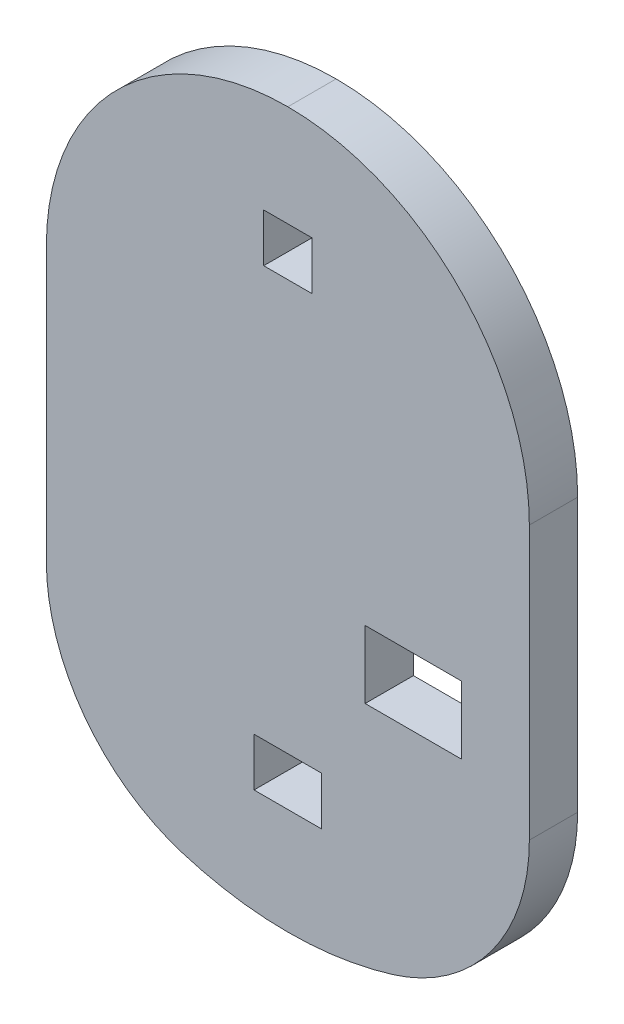
ISO-10303-21;
HEADER;
FILE_DESCRIPTION(('STEP AP214'),'2;1');
FILE_NAME('part.step','',(''),(''),'','','');
FILE_SCHEMA(('AUTOMOTIVE_DESIGN { 1 0 10303 214 1 1 1 1 }'));
ENDSEC;
DATA;
#1=APPLICATION_CONTEXT('core data for automotive mechanical design processes');
#2=APPLICATION_PROTOCOL_DEFINITION('international standard','automotive_design',2000,#1);
#3=PRODUCT_CONTEXT('',#1,'mechanical');
#4=PRODUCT('Part','Part','',(#3));
#5=PRODUCT_RELATED_PRODUCT_CATEGORY('part','',(#4));
#6=PRODUCT_DEFINITION_FORMATION('','',#4);
#7=PRODUCT_DEFINITION_CONTEXT('part definition',#1,'design');
#8=PRODUCT_DEFINITION('design','',#6,#7);
#9=PRODUCT_DEFINITION_SHAPE('','',#8);
#10=(LENGTH_UNIT() NAMED_UNIT(*) SI_UNIT(.MILLI.,.METRE.));
#11=(NAMED_UNIT(*) PLANE_ANGLE_UNIT() SI_UNIT($,.RADIAN.));
#12=(NAMED_UNIT(*) SI_UNIT($,.STERADIAN.) SOLID_ANGLE_UNIT());
#13=UNCERTAINTY_MEASURE_WITH_UNIT(LENGTH_MEASURE(1.E-05),#10,'distance_accuracy_value','');
#14=(GEOMETRIC_REPRESENTATION_CONTEXT(3) GLOBAL_UNCERTAINTY_ASSIGNED_CONTEXT((#13)) GLOBAL_UNIT_ASSIGNED_CONTEXT((#10,
#11,#12)) REPRESENTATION_CONTEXT('',''));
#15=CARTESIAN_POINT('',(0.,0.,0.));
#16=DIRECTION('',(0.,0.,1.));
#17=DIRECTION('',(1.,0.,0.));
#18=AXIS2_PLACEMENT_3D('',#15,#16,#17);
#19=CARTESIAN_POINT('',(0.,0.,5.));
#20=DIRECTION('',(0.,0.,-1.));
#21=DIRECTION('',(-1.,0.,0.));
#22=AXIS2_PLACEMENT_3D('',#19,#20,#21);
#23=CYLINDRICAL_SURFACE('',#22,37.);
#24=CARTESIAN_POINT('',(0.,0.,0.));
#25=DIRECTION('',(0.,0.,1.));
#26=DIRECTION('',(1.,0.,0.));
#27=AXIS2_PLACEMENT_3D('',#24,#25,#26);
#28=CIRCLE('',#27,37.);
#29=CARTESIAN_POINT('',(-10.8823529411765,-35.3634612907683,0.));
#30=VERTEX_POINT('',#29);
#31=CARTESIAN_POINT('',(10.8823529411765,-35.3634612907683,0.));
#32=VERTEX_POINT('',#31);
#33=EDGE_CURVE('E243',#30,#32,#28,.T.);
#34=ORIENTED_EDGE('',*,*,#33,.T.);
#35=DIRECTION('',(0.,0.,-1.));
#36=VECTOR('',#35,1.);
#37=CARTESIAN_POINT('',(10.8823529411765,-35.3634612907683,5.));
#38=LINE('',#37,#36);
#39=CARTESIAN_POINT('',(10.8823529411765,-35.3634612907683,5.));
#40=VERTEX_POINT('',#39);
#41=EDGE_CURVE('E275',#32,#40,#38,.F.);
#42=ORIENTED_EDGE('',*,*,#41,.T.);
#43=CARTESIAN_POINT('',(0.,0.,5.));
#44=DIRECTION('',(0.,0.,1.));
#45=DIRECTION('',(1.,0.,0.));
#46=AXIS2_PLACEMENT_3D('',#43,#44,#45);
#47=CIRCLE('',#46,37.);
#48=CARTESIAN_POINT('',(-10.8823529411765,-35.3634612907683,5.));
#49=VERTEX_POINT('',#48);
#50=EDGE_CURVE('E247',#49,#40,#47,.T.);
#51=ORIENTED_EDGE('',*,*,#50,.F.);
#52=DIRECTION('',(0.,0.,-1.));
#53=VECTOR('',#52,1.);
#54=CARTESIAN_POINT('',(-10.8823529411765,-35.3634612907683,5.));
#55=LINE('',#54,#53);
#56=EDGE_CURVE('E271',#49,#30,#55,.T.);
#57=ORIENTED_EDGE('',*,*,#56,.T.);
#58=EDGE_LOOP('',(#34,#42,#51,#57));
#59=FACE_BOUND('',#58,.T.);
#60=ADVANCED_FACE('F41',(#59),#23,.T.);
#61=CARTESIAN_POINT('',(0.,0.,5.));
#62=DIRECTION('',(0.,0.,1.));
#63=DIRECTION('',(1.,0.,0.));
#64=AXIS2_PLACEMENT_3D('',#61,#62,#63);
#65=PLANE('',#64);
#66=DIRECTION('',(0.,-1.,0.));
#67=VECTOR('',#66,1.);
#68=CARTESIAN_POINT('',(8.,-5.50000000000001,5.));
#69=LINE('',#68,#67);
#70=CARTESIAN_POINT('',(8.,-5.50000000000001,5.));
#71=VERTEX_POINT('',#70);
#72=CARTESIAN_POINT('',(8.00000000000001,-12.5,5.));
#73=VERTEX_POINT('',#72);
#74=EDGE_CURVE('E56',#71,#73,#69,.T.);
#75=ORIENTED_EDGE('',*,*,#74,.F.);
#76=DIRECTION('',(-1.,0.,0.));
#77=VECTOR('',#76,1.);
#78=CARTESIAN_POINT('',(8.,-5.50000000000001,5.));
#79=LINE('',#78,#77);
#80=CARTESIAN_POINT('',(18.,-5.50000000000001,5.));
#81=VERTEX_POINT('',#80);
#82=EDGE_CURVE('E191',#81,#71,#79,.T.);
#83=ORIENTED_EDGE('',*,*,#82,.F.);
#84=DIRECTION('',(0.,1.,0.));
#85=VECTOR('',#84,1.);
#86=CARTESIAN_POINT('',(18.,-5.50000000000001,5.));
#87=LINE('',#86,#85);
#88=CARTESIAN_POINT('',(18.,-12.5,5.));
#89=VERTEX_POINT('',#88);
#90=EDGE_CURVE('E175',#89,#81,#87,.T.);
#91=ORIENTED_EDGE('',*,*,#90,.F.);
#92=DIRECTION('',(1.,0.,0.));
#93=VECTOR('',#92,1.);
#94=CARTESIAN_POINT('',(8.00000000000001,-12.5,5.));
#95=LINE('',#94,#93);
#96=EDGE_CURVE('E184',#73,#89,#95,.T.);
#97=ORIENTED_EDGE('',*,*,#96,.F.);
#98=EDGE_LOOP('',(#75,#83,#91,#97));
#99=FACE_BOUND('',#98,.T.);
#100=DIRECTION('',(0.,-1.,0.));
#101=VECTOR('',#100,1.);
#102=CARTESIAN_POINT('',(-2.5,26.5,5.));
#103=LINE('',#102,#101);
#104=CARTESIAN_POINT('',(-2.5,26.5,5.));
#105=VERTEX_POINT('',#104);
#106=CARTESIAN_POINT('',(-2.5,21.5,5.));
#107=VERTEX_POINT('',#106);
#108=EDGE_CURVE('E201',#105,#107,#103,.T.);
#109=ORIENTED_EDGE('',*,*,#108,.F.);
#110=DIRECTION('',(-1.,0.,0.));
#111=VECTOR('',#110,1.);
#112=CARTESIAN_POINT('',(-2.5,26.5,5.));
#113=LINE('',#112,#111);
#114=CARTESIAN_POINT('',(2.5,26.5,5.));
#115=VERTEX_POINT('',#114);
#116=EDGE_CURVE('E210',#115,#105,#113,.T.);
#117=ORIENTED_EDGE('',*,*,#116,.F.);
#118=DIRECTION('',(0.,1.,0.));
#119=VECTOR('',#118,1.);
#120=CARTESIAN_POINT('',(2.5,26.5,5.));
#121=LINE('',#120,#119);
#122=CARTESIAN_POINT('',(2.5,21.5,5.));
#123=VERTEX_POINT('',#122);
#124=EDGE_CURVE('E207',#123,#115,#121,.T.);
#125=ORIENTED_EDGE('',*,*,#124,.F.);
#126=DIRECTION('',(1.,0.,0.));
#127=VECTOR('',#126,1.);
#128=CARTESIAN_POINT('',(-2.5,21.5,5.));
#129=LINE('',#128,#127);
#130=EDGE_CURVE('E203',#107,#123,#129,.T.);
#131=ORIENTED_EDGE('',*,*,#130,.F.);
#132=EDGE_LOOP('',(#109,#117,#125,#131));
#133=FACE_BOUND('',#132,.T.);
#134=DIRECTION('',(0.,-1.,0.));
#135=VECTOR('',#134,1.);
#136=CARTESIAN_POINT('',(-3.5,-21.,5.));
#137=LINE('',#136,#135);
#138=CARTESIAN_POINT('',(-3.5,-21.,5.));
#139=VERTEX_POINT('',#138);
#140=CARTESIAN_POINT('',(-3.5,-26.,5.));
#141=VERTEX_POINT('',#140);
#142=EDGE_CURVE('E198',#139,#141,#137,.T.);
#143=ORIENTED_EDGE('',*,*,#142,.F.);
#144=DIRECTION('',(-1.,0.,0.));
#145=VECTOR('',#144,1.);
#146=CARTESIAN_POINT('',(-3.5,-21.,5.));
#147=LINE('',#146,#145);
#148=CARTESIAN_POINT('',(3.5,-21.,5.));
#149=VERTEX_POINT('',#148);
#150=EDGE_CURVE('E230',#149,#139,#147,.T.);
#151=ORIENTED_EDGE('',*,*,#150,.F.);
#152=DIRECTION('',(0.,1.,0.));
#153=VECTOR('',#152,1.);
#154=CARTESIAN_POINT('',(3.5,-21.,5.));
#155=LINE('',#154,#153);
#156=CARTESIAN_POINT('',(3.5,-26.,5.));
#157=VERTEX_POINT('',#156);
#158=EDGE_CURVE('E227',#157,#149,#155,.T.);
#159=ORIENTED_EDGE('',*,*,#158,.F.);
#160=DIRECTION('',(1.,0.,0.));
#161=VECTOR('',#160,1.);
#162=CARTESIAN_POINT('',(-3.5,-26.,5.));
#163=LINE('',#162,#161);
#164=EDGE_CURVE('E224',#141,#157,#163,.T.);
#165=ORIENTED_EDGE('',*,*,#164,.F.);
#166=EDGE_LOOP('',(#143,#151,#159,#165));
#167=FACE_BOUND('',#166,.T.);
#168=ORIENTED_EDGE('',*,*,#50,.T.);
#169=CARTESIAN_POINT('',(5.,-16.2480768092719,5.));
#170=DIRECTION('',(0.,0.,1.));
#171=DIRECTION('',(1.,0.,0.));
#172=AXIS2_PLACEMENT_3D('',#169,#170,#171);
#173=CIRCLE('',#172,20.);
#174=CARTESIAN_POINT('',(25.,-16.2480768092719,5.));
#175=VERTEX_POINT('',#174);
#176=EDGE_CURVE('E280',#40,#175,#173,.T.);
#177=ORIENTED_EDGE('',*,*,#176,.T.);
#178=DIRECTION('',(0.,-1.,0.));
#179=VECTOR('',#178,1.);
#180=CARTESIAN_POINT('',(25.,-27.2763633939717,5.));
#181=LINE('',#180,#179);
#182=CARTESIAN_POINT('',(25.,12.,5.));
#183=VERTEX_POINT('',#182);
#184=EDGE_CURVE('E244',#183,#175,#181,.T.);
#185=ORIENTED_EDGE('',*,*,#184,.F.);
#186=CARTESIAN_POINT('',(0.,12.,5.));
#187=DIRECTION('',(0.,0.,1.));
#188=DIRECTION('',(1.,0.,0.));
#189=AXIS2_PLACEMENT_3D('',#186,#187,#188);
#190=CIRCLE('',#189,25.);
#191=CARTESIAN_POINT('',(0.,37.,5.));
#192=VERTEX_POINT('',#191);
#193=EDGE_CURVE('E257',#183,#192,#190,.T.);
#194=ORIENTED_EDGE('',*,*,#193,.T.);
#195=CARTESIAN_POINT('',(0.,12.,5.));
#196=DIRECTION('',(0.,0.,1.));
#197=DIRECTION('',(1.,0.,0.));
#198=AXIS2_PLACEMENT_3D('',#195,#196,#197);
#199=CIRCLE('',#198,25.);
#200=CARTESIAN_POINT('',(-25.,12.,5.));
#201=VERTEX_POINT('',#200);
#202=EDGE_CURVE('E259',#192,#201,#199,.T.);
#203=ORIENTED_EDGE('',*,*,#202,.T.);
#204=DIRECTION('',(0.,1.,0.));
#205=VECTOR('',#204,1.);
#206=CARTESIAN_POINT('',(-25.,27.2763633939717,5.));
#207=LINE('',#206,#205);
#208=CARTESIAN_POINT('',(-25.,-16.2480768092719,5.));
#209=VERTEX_POINT('',#208);
#210=EDGE_CURVE('E241',#209,#201,#207,.T.);
#211=ORIENTED_EDGE('',*,*,#210,.F.);
#212=CARTESIAN_POINT('',(-4.99999999999999,-16.2480768092719,5.));
#213=DIRECTION('',(0.,0.,1.));
#214=DIRECTION('',(1.,0.,0.));
#215=AXIS2_PLACEMENT_3D('',#212,#213,#214);
#216=CIRCLE('',#215,20.);
#217=EDGE_CURVE('E278',#209,#49,#216,.T.);
#218=ORIENTED_EDGE('',*,*,#217,.T.);
#219=EDGE_LOOP('',(#168,#177,#185,#194,#203,#211,#218));
#220=FACE_BOUND('',#219,.T.);
#221=ADVANCED_FACE('F188',(#99,#133,#167,#220),#65,.T.);
#222=CARTESIAN_POINT('',(0.,0.,0.));
#223=DIRECTION('',(0.,0.,1.));
#224=DIRECTION('',(1.,0.,0.));
#225=AXIS2_PLACEMENT_3D('',#222,#223,#224);
#226=PLANE('',#225);
#227=DIRECTION('',(-1.,0.,0.));
#228=VECTOR('',#227,1.);
#229=CARTESIAN_POINT('',(0.,-5.50000000000001,0.));
#230=LINE('',#229,#228);
#231=CARTESIAN_POINT('',(18.,-5.50000000000001,0.));
#232=VERTEX_POINT('',#231);
#233=CARTESIAN_POINT('',(8.,-5.50000000000001,0.));
#234=VERTEX_POINT('',#233);
#235=EDGE_CURVE('E49',#232,#234,#230,.T.);
#236=ORIENTED_EDGE('',*,*,#235,.T.);
#237=DIRECTION('',(0.,-1.,0.));
#238=VECTOR('',#237,1.);
#239=CARTESIAN_POINT('',(8.,0.,0.));
#240=LINE('',#239,#238);
#241=CARTESIAN_POINT('',(8.00000000000001,-12.5,0.));
#242=VERTEX_POINT('',#241);
#243=EDGE_CURVE('E11',#234,#242,#240,.T.);
#244=ORIENTED_EDGE('',*,*,#243,.T.);
#245=DIRECTION('',(1.,0.,0.));
#246=VECTOR('',#245,1.);
#247=CARTESIAN_POINT('',(0.,-12.5,0.));
#248=LINE('',#247,#246);
#249=CARTESIAN_POINT('',(18.,-12.5,0.));
#250=VERTEX_POINT('',#249);
#251=EDGE_CURVE('E315',#242,#250,#248,.T.);
#252=ORIENTED_EDGE('',*,*,#251,.T.);
#253=DIRECTION('',(0.,1.,0.));
#254=VECTOR('',#253,1.);
#255=CARTESIAN_POINT('',(18.,0.,0.));
#256=LINE('',#255,#254);
#257=EDGE_CURVE('E178',#250,#232,#256,.T.);
#258=ORIENTED_EDGE('',*,*,#257,.T.);
#259=EDGE_LOOP('',(#236,#244,#252,#258));
#260=FACE_BOUND('',#259,.T.);
#261=DIRECTION('',(-1.,0.,0.));
#262=VECTOR('',#261,1.);
#263=CARTESIAN_POINT('',(0.,26.5,0.));
#264=LINE('',#263,#262);
#265=CARTESIAN_POINT('',(2.5,26.5,0.));
#266=VERTEX_POINT('',#265);
#267=CARTESIAN_POINT('',(-2.5,26.5,0.));
#268=VERTEX_POINT('',#267);
#269=EDGE_CURVE('E309',#266,#268,#264,.T.);
#270=ORIENTED_EDGE('',*,*,#269,.T.);
#271=DIRECTION('',(0.,-1.,0.));
#272=VECTOR('',#271,1.);
#273=CARTESIAN_POINT('',(-2.5,0.,0.));
#274=LINE('',#273,#272);
#275=CARTESIAN_POINT('',(-2.5,21.5,0.));
#276=VERTEX_POINT('',#275);
#277=EDGE_CURVE('E312',#268,#276,#274,.T.);
#278=ORIENTED_EDGE('',*,*,#277,.T.);
#279=DIRECTION('',(1.,0.,0.));
#280=VECTOR('',#279,1.);
#281=CARTESIAN_POINT('',(0.,21.5,0.));
#282=LINE('',#281,#280);
#283=CARTESIAN_POINT('',(2.5,21.5,0.));
#284=VERTEX_POINT('',#283);
#285=EDGE_CURVE('E303',#276,#284,#282,.T.);
#286=ORIENTED_EDGE('',*,*,#285,.T.);
#287=DIRECTION('',(0.,1.,0.));
#288=VECTOR('',#287,1.);
#289=CARTESIAN_POINT('',(2.5,0.,0.));
#290=LINE('',#289,#288);
#291=EDGE_CURVE('E306',#284,#266,#290,.T.);
#292=ORIENTED_EDGE('',*,*,#291,.T.);
#293=EDGE_LOOP('',(#270,#278,#286,#292));
#294=FACE_BOUND('',#293,.T.);
#295=DIRECTION('',(-1.,0.,0.));
#296=VECTOR('',#295,1.);
#297=CARTESIAN_POINT('',(0.,-21.,0.));
#298=LINE('',#297,#296);
#299=CARTESIAN_POINT('',(3.5,-21.,0.));
#300=VERTEX_POINT('',#299);
#301=CARTESIAN_POINT('',(-3.5,-21.,0.));
#302=VERTEX_POINT('',#301);
#303=EDGE_CURVE('E297',#300,#302,#298,.T.);
#304=ORIENTED_EDGE('',*,*,#303,.T.);
#305=DIRECTION('',(0.,-1.,0.));
#306=VECTOR('',#305,1.);
#307=CARTESIAN_POINT('',(-3.5,0.,0.));
#308=LINE('',#307,#306);
#309=CARTESIAN_POINT('',(-3.5,-26.,0.));
#310=VERTEX_POINT('',#309);
#311=EDGE_CURVE('E300',#302,#310,#308,.T.);
#312=ORIENTED_EDGE('',*,*,#311,.T.);
#313=DIRECTION('',(1.,0.,0.));
#314=VECTOR('',#313,1.);
#315=CARTESIAN_POINT('',(0.,-26.,0.));
#316=LINE('',#315,#314);
#317=CARTESIAN_POINT('',(3.5,-26.,0.));
#318=VERTEX_POINT('',#317);
#319=EDGE_CURVE('E291',#310,#318,#316,.T.);
#320=ORIENTED_EDGE('',*,*,#319,.T.);
#321=DIRECTION('',(0.,1.,0.));
#322=VECTOR('',#321,1.);
#323=CARTESIAN_POINT('',(3.5,0.,0.));
#324=LINE('',#323,#322);
#325=EDGE_CURVE('E294',#318,#300,#324,.T.);
#326=ORIENTED_EDGE('',*,*,#325,.T.);
#327=EDGE_LOOP('',(#304,#312,#320,#326));
#328=FACE_BOUND('',#327,.T.);
#329=DIRECTION('',(0.,-1.,0.));
#330=VECTOR('',#329,1.);
#331=CARTESIAN_POINT('',(25.,0.,0.));
#332=LINE('',#331,#330);
#333=CARTESIAN_POINT('',(25.,12.,0.));
#334=VERTEX_POINT('',#333);
#335=CARTESIAN_POINT('',(25.,-16.2480768092719,0.));
#336=VERTEX_POINT('',#335);
#337=EDGE_CURVE('E250',#334,#336,#332,.T.);
#338=ORIENTED_EDGE('',*,*,#337,.T.);
#339=CARTESIAN_POINT('',(5.,-16.2480768092719,0.));
#340=DIRECTION('',(0.,0.,1.));
#341=DIRECTION('',(1.,0.,0.));
#342=AXIS2_PLACEMENT_3D('',#339,#340,#341);
#343=CIRCLE('',#342,20.);
#344=EDGE_CURVE('E286',#336,#32,#343,.F.);
#345=ORIENTED_EDGE('',*,*,#344,.T.);
#346=ORIENTED_EDGE('',*,*,#33,.F.);
#347=CARTESIAN_POINT('',(-4.99999999999999,-16.2480768092719,0.));
#348=DIRECTION('',(0.,0.,1.));
#349=DIRECTION('',(1.,0.,0.));
#350=AXIS2_PLACEMENT_3D('',#347,#348,#349);
#351=CIRCLE('',#350,20.);
#352=CARTESIAN_POINT('',(-25.,-16.2480768092719,0.));
#353=VERTEX_POINT('',#352);
#354=EDGE_CURVE('E284',#30,#353,#351,.F.);
#355=ORIENTED_EDGE('',*,*,#354,.T.);
#356=DIRECTION('',(0.,1.,0.));
#357=VECTOR('',#356,1.);
#358=CARTESIAN_POINT('',(-25.,0.,0.));
#359=LINE('',#358,#357);
#360=CARTESIAN_POINT('',(-25.,12.,0.));
#361=VERTEX_POINT('',#360);
#362=EDGE_CURVE('E255',#353,#361,#359,.T.);
#363=ORIENTED_EDGE('',*,*,#362,.T.);
#364=CARTESIAN_POINT('',(0.,12.,0.));
#365=DIRECTION('',(0.,0.,1.));
#366=DIRECTION('',(1.,0.,0.));
#367=AXIS2_PLACEMENT_3D('',#364,#365,#366);
#368=CIRCLE('',#367,25.);
#369=CARTESIAN_POINT('',(0.,37.,0.));
#370=VERTEX_POINT('',#369);
#371=EDGE_CURVE('E267',#361,#370,#368,.F.);
#372=ORIENTED_EDGE('',*,*,#371,.T.);
#373=CARTESIAN_POINT('',(0.,12.,0.));
#374=DIRECTION('',(0.,0.,1.));
#375=DIRECTION('',(1.,0.,0.));
#376=AXIS2_PLACEMENT_3D('',#373,#374,#375);
#377=CIRCLE('',#376,25.);
#378=EDGE_CURVE('E265',#370,#334,#377,.F.);
#379=ORIENTED_EDGE('',*,*,#378,.T.);
#380=EDGE_LOOP('',(#338,#345,#346,#355,#363,#372,#379));
#381=FACE_BOUND('',#380,.T.);
#382=ADVANCED_FACE('F319',(#260,#294,#328,#381),#226,.F.);
#383=CARTESIAN_POINT('',(25.,-27.2763633939717,-5.));
#384=DIRECTION('',(-1.,0.,0.));
#385=DIRECTION('',(0.,0.,1.));
#386=AXIS2_PLACEMENT_3D('',#383,#384,#385);
#387=PLANE('',#386);
#388=ORIENTED_EDGE('',*,*,#184,.T.);
#389=DIRECTION('',(0.,0.,-1.));
#390=VECTOR('',#389,1.);
#391=CARTESIAN_POINT('',(25.,-16.2480768092719,-5.));
#392=LINE('',#391,#390);
#393=EDGE_CURVE('E282',#175,#336,#392,.T.);
#394=ORIENTED_EDGE('',*,*,#393,.T.);
#395=ORIENTED_EDGE('',*,*,#337,.F.);
#396=DIRECTION('',(0.,0.,-1.));
#397=VECTOR('',#396,1.);
#398=CARTESIAN_POINT('',(25.,12.,-5.));
#399=LINE('',#398,#397);
#400=EDGE_CURVE('E269',#334,#183,#399,.F.);
#401=ORIENTED_EDGE('',*,*,#400,.T.);
#402=EDGE_LOOP('',(#388,#394,#395,#401));
#403=FACE_BOUND('',#402,.T.);
#404=ADVANCED_FACE('F385',(#403),#387,.F.);
#405=CARTESIAN_POINT('',(-25.,27.2763633939717,-5.));
#406=DIRECTION('',(1.,0.,0.));
#407=DIRECTION('',(0.,0.,-1.));
#408=AXIS2_PLACEMENT_3D('',#405,#406,#407);
#409=PLANE('',#408);
#410=ORIENTED_EDGE('',*,*,#362,.F.);
#411=DIRECTION('',(0.,0.,-1.));
#412=VECTOR('',#411,1.);
#413=CARTESIAN_POINT('',(-25.,-16.2480768092719,-5.));
#414=LINE('',#413,#412);
#415=EDGE_CURVE('E288',#353,#209,#414,.F.);
#416=ORIENTED_EDGE('',*,*,#415,.T.);
#417=ORIENTED_EDGE('',*,*,#210,.T.);
#418=DIRECTION('',(0.,0.,-1.));
#419=VECTOR('',#418,1.);
#420=CARTESIAN_POINT('',(-25.,12.,-5.));
#421=LINE('',#420,#419);
#422=EDGE_CURVE('E262',#201,#361,#421,.T.);
#423=ORIENTED_EDGE('',*,*,#422,.T.);
#424=EDGE_LOOP('',(#410,#416,#417,#423));
#425=FACE_BOUND('',#424,.T.);
#426=ADVANCED_FACE('F354',(#425),#409,.F.);
#427=CARTESIAN_POINT('',(0.,12.,5.));
#428=DIRECTION('',(0.,0.,-1.));
#429=DIRECTION('',(-1.,0.,0.));
#430=AXIS2_PLACEMENT_3D('',#427,#428,#429);
#431=CYLINDRICAL_SURFACE('',#430,25.);
#432=ORIENTED_EDGE('',*,*,#400,.F.);
#433=ORIENTED_EDGE('',*,*,#378,.F.);
#434=DIRECTION('',(0.,0.,-1.));
#435=VECTOR('',#434,1.);
#436=CARTESIAN_POINT('',(0.,37.,5.));
#437=LINE('',#436,#435);
#438=EDGE_CURVE('E216',#192,#370,#437,.T.);
#439=ORIENTED_EDGE('',*,*,#438,.F.);
#440=ORIENTED_EDGE('',*,*,#193,.F.);
#441=EDGE_LOOP('',(#432,#433,#439,#440));
#442=FACE_BOUND('',#441,.T.);
#443=ADVANCED_FACE('F351',(#442),#431,.T.);
#444=CARTESIAN_POINT('',(0.,12.,5.));
#445=DIRECTION('',(0.,0.,-1.));
#446=DIRECTION('',(-1.,0.,0.));
#447=AXIS2_PLACEMENT_3D('',#444,#445,#446);
#448=CYLINDRICAL_SURFACE('',#447,25.);
#449=ORIENTED_EDGE('',*,*,#371,.F.);
#450=ORIENTED_EDGE('',*,*,#422,.F.);
#451=ORIENTED_EDGE('',*,*,#202,.F.);
#452=ORIENTED_EDGE('',*,*,#438,.T.);
#453=EDGE_LOOP('',(#449,#450,#451,#452));
#454=FACE_BOUND('',#453,.T.);
#455=ADVANCED_FACE('F347',(#454),#448,.T.);
#456=CARTESIAN_POINT('',(5.,-16.2480768092719,5.));
#457=DIRECTION('',(0.,0.,-1.));
#458=DIRECTION('',(-1.,0.,0.));
#459=AXIS2_PLACEMENT_3D('',#456,#457,#458);
#460=CYLINDRICAL_SURFACE('',#459,20.);
#461=ORIENTED_EDGE('',*,*,#344,.F.);
#462=ORIENTED_EDGE('',*,*,#393,.F.);
#463=ORIENTED_EDGE('',*,*,#176,.F.);
#464=ORIENTED_EDGE('',*,*,#41,.F.);
#465=EDGE_LOOP('',(#461,#462,#463,#464));
#466=FACE_BOUND('',#465,.T.);
#467=ADVANCED_FACE('F350',(#466),#460,.T.);
#468=CARTESIAN_POINT('',(-4.99999999999999,-16.2480768092719,5.));
#469=DIRECTION('',(0.,0.,-1.));
#470=DIRECTION('',(-1.,0.,0.));
#471=AXIS2_PLACEMENT_3D('',#468,#469,#470);
#472=CYLINDRICAL_SURFACE('',#471,20.);
#473=ORIENTED_EDGE('',*,*,#354,.F.);
#474=ORIENTED_EDGE('',*,*,#56,.F.);
#475=ORIENTED_EDGE('',*,*,#217,.F.);
#476=ORIENTED_EDGE('',*,*,#415,.F.);
#477=EDGE_LOOP('',(#473,#474,#475,#476));
#478=FACE_BOUND('',#477,.T.);
#479=ADVANCED_FACE('F43',(#478),#472,.T.);
#480=CARTESIAN_POINT('',(-3.5,-21.,-5.));
#481=DIRECTION('',(-1.,0.,0.));
#482=DIRECTION('',(0.,-1.,0.));
#483=AXIS2_PLACEMENT_3D('',#480,#481,#482);
#484=PLANE('',#483);
#485=DIRECTION('',(0.,0.,1.));
#486=VECTOR('',#485,1.);
#487=CARTESIAN_POINT('',(-3.5,-21.,-5.));
#488=LINE('',#487,#486);
#489=EDGE_CURVE('E204',#302,#139,#488,.T.);
#490=ORIENTED_EDGE('',*,*,#489,.T.);
#491=ORIENTED_EDGE('',*,*,#142,.T.);
#492=DIRECTION('',(0.,0.,1.));
#493=VECTOR('',#492,1.);
#494=CARTESIAN_POINT('',(-3.5,-26.,-5.));
#495=LINE('',#494,#493);
#496=EDGE_CURVE('E233',#310,#141,#495,.T.);
#497=ORIENTED_EDGE('',*,*,#496,.F.);
#498=ORIENTED_EDGE('',*,*,#311,.F.);
#499=EDGE_LOOP('',(#490,#491,#497,#498));
#500=FACE_BOUND('',#499,.T.);
#501=ADVANCED_FACE('F361',(#500),#484,.F.);
#502=CARTESIAN_POINT('',(-3.5,-21.,-5.));
#503=DIRECTION('',(0.,1.,0.));
#504=DIRECTION('',(0.,0.,1.));
#505=AXIS2_PLACEMENT_3D('',#502,#503,#504);
#506=PLANE('',#505);
#507=DIRECTION('',(0.,0.,1.));
#508=VECTOR('',#507,1.);
#509=CARTESIAN_POINT('',(3.5,-21.,-5.));
#510=LINE('',#509,#508);
#511=EDGE_CURVE('E235',#300,#149,#510,.T.);
#512=ORIENTED_EDGE('',*,*,#511,.T.);
#513=ORIENTED_EDGE('',*,*,#150,.T.);
#514=ORIENTED_EDGE('',*,*,#489,.F.);
#515=ORIENTED_EDGE('',*,*,#303,.F.);
#516=EDGE_LOOP('',(#512,#513,#514,#515));
#517=FACE_BOUND('',#516,.T.);
#518=ADVANCED_FACE('F397',(#517),#506,.F.);
#519=CARTESIAN_POINT('',(3.5,-21.,-5.));
#520=DIRECTION('',(1.,0.,0.));
#521=DIRECTION('',(0.,1.,0.));
#522=AXIS2_PLACEMENT_3D('',#519,#520,#521);
#523=PLANE('',#522);
#524=DIRECTION('',(0.,0.,1.));
#525=VECTOR('',#524,1.);
#526=CARTESIAN_POINT('',(3.5,-26.,-5.));
#527=LINE('',#526,#525);
#528=EDGE_CURVE('E237',#318,#157,#527,.T.);
#529=ORIENTED_EDGE('',*,*,#528,.T.);
#530=ORIENTED_EDGE('',*,*,#158,.T.);
#531=ORIENTED_EDGE('',*,*,#511,.F.);
#532=ORIENTED_EDGE('',*,*,#325,.F.);
#533=EDGE_LOOP('',(#529,#530,#531,#532));
#534=FACE_BOUND('',#533,.T.);
#535=ADVANCED_FACE('F403',(#534),#523,.F.);
#536=CARTESIAN_POINT('',(-3.5,-26.,-5.));
#537=DIRECTION('',(0.,-1.,0.));
#538=DIRECTION('',(0.,0.,-1.));
#539=AXIS2_PLACEMENT_3D('',#536,#537,#538);
#540=PLANE('',#539);
#541=ORIENTED_EDGE('',*,*,#496,.T.);
#542=ORIENTED_EDGE('',*,*,#164,.T.);
#543=ORIENTED_EDGE('',*,*,#528,.F.);
#544=ORIENTED_EDGE('',*,*,#319,.F.);
#545=EDGE_LOOP('',(#541,#542,#543,#544));
#546=FACE_BOUND('',#545,.T.);
#547=ADVANCED_FACE('F399',(#546),#540,.F.);
#548=CARTESIAN_POINT('',(-2.5,26.5,-5.));
#549=DIRECTION('',(-1.,0.,0.));
#550=DIRECTION('',(0.,-1.,0.));
#551=AXIS2_PLACEMENT_3D('',#548,#549,#550);
#552=PLANE('',#551);
#553=DIRECTION('',(0.,0.,1.));
#554=VECTOR('',#553,1.);
#555=CARTESIAN_POINT('',(-2.5,26.5,-5.));
#556=LINE('',#555,#554);
#557=EDGE_CURVE('E214',#268,#105,#556,.T.);
#558=ORIENTED_EDGE('',*,*,#557,.T.);
#559=ORIENTED_EDGE('',*,*,#108,.T.);
#560=DIRECTION('',(0.,0.,1.));
#561=VECTOR('',#560,1.);
#562=CARTESIAN_POINT('',(-2.5,21.5,-5.));
#563=LINE('',#562,#561);
#564=EDGE_CURVE('E213',#276,#107,#563,.T.);
#565=ORIENTED_EDGE('',*,*,#564,.F.);
#566=ORIENTED_EDGE('',*,*,#277,.F.);
#567=EDGE_LOOP('',(#558,#559,#565,#566));
#568=FACE_BOUND('',#567,.T.);
#569=ADVANCED_FACE('F402',(#568),#552,.F.);
#570=CARTESIAN_POINT('',(-2.5,26.5,-5.));
#571=DIRECTION('',(0.,1.,0.));
#572=DIRECTION('',(0.,0.,1.));
#573=AXIS2_PLACEMENT_3D('',#570,#571,#572);
#574=PLANE('',#573);
#575=DIRECTION('',(0.,0.,1.));
#576=VECTOR('',#575,1.);
#577=CARTESIAN_POINT('',(2.5,26.5,-5.));
#578=LINE('',#577,#576);
#579=EDGE_CURVE('E217',#266,#115,#578,.T.);
#580=ORIENTED_EDGE('',*,*,#579,.T.);
#581=ORIENTED_EDGE('',*,*,#116,.T.);
#582=ORIENTED_EDGE('',*,*,#557,.F.);
#583=ORIENTED_EDGE('',*,*,#269,.F.);
#584=EDGE_LOOP('',(#580,#581,#582,#583));
#585=FACE_BOUND('',#584,.T.);
#586=ADVANCED_FACE('F412',(#585),#574,.F.);
#587=CARTESIAN_POINT('',(2.5,26.5,-5.));
#588=DIRECTION('',(1.,0.,0.));
#589=DIRECTION('',(0.,1.,0.));
#590=AXIS2_PLACEMENT_3D('',#587,#588,#589);
#591=PLANE('',#590);
#592=DIRECTION('',(0.,0.,1.));
#593=VECTOR('',#592,1.);
#594=CARTESIAN_POINT('',(2.5,21.5,-5.));
#595=LINE('',#594,#593);
#596=EDGE_CURVE('E219',#284,#123,#595,.T.);
#597=ORIENTED_EDGE('',*,*,#596,.T.);
#598=ORIENTED_EDGE('',*,*,#124,.T.);
#599=ORIENTED_EDGE('',*,*,#579,.F.);
#600=ORIENTED_EDGE('',*,*,#291,.F.);
#601=EDGE_LOOP('',(#597,#598,#599,#600));
#602=FACE_BOUND('',#601,.T.);
#603=ADVANCED_FACE('F333',(#602),#591,.F.);
#604=CARTESIAN_POINT('',(-2.5,21.5,-5.));
#605=DIRECTION('',(0.,-1.,0.));
#606=DIRECTION('',(0.,0.,-1.));
#607=AXIS2_PLACEMENT_3D('',#604,#605,#606);
#608=PLANE('',#607);
#609=ORIENTED_EDGE('',*,*,#564,.T.);
#610=ORIENTED_EDGE('',*,*,#130,.T.);
#611=ORIENTED_EDGE('',*,*,#596,.F.);
#612=ORIENTED_EDGE('',*,*,#285,.F.);
#613=EDGE_LOOP('',(#609,#610,#611,#612));
#614=FACE_BOUND('',#613,.T.);
#615=ADVANCED_FACE('F326',(#614),#608,.F.);
#616=CARTESIAN_POINT('',(8.,-5.50000000000001,-5.));
#617=DIRECTION('',(-1.,0.,0.));
#618=DIRECTION('',(0.,-1.,0.));
#619=AXIS2_PLACEMENT_3D('',#616,#617,#618);
#620=PLANE('',#619);
#621=DIRECTION('',(0.,0.,1.));
#622=VECTOR('',#621,1.);
#623=CARTESIAN_POINT('',(8.,-5.50000000000001,-5.));
#624=LINE('',#623,#622);
#625=EDGE_CURVE('E196',#234,#71,#624,.T.);
#626=ORIENTED_EDGE('',*,*,#625,.T.);
#627=ORIENTED_EDGE('',*,*,#74,.T.);
#628=DIRECTION('',(0.,0.,1.));
#629=VECTOR('',#628,1.);
#630=CARTESIAN_POINT('',(8.00000000000001,-12.5,-5.));
#631=LINE('',#630,#629);
#632=EDGE_CURVE('E181',#242,#73,#631,.T.);
#633=ORIENTED_EDGE('',*,*,#632,.F.);
#634=ORIENTED_EDGE('',*,*,#243,.F.);
#635=EDGE_LOOP('',(#626,#627,#633,#634));
#636=FACE_BOUND('',#635,.T.);
#637=ADVANCED_FACE('F324',(#636),#620,.F.);
#638=CARTESIAN_POINT('',(8.,-5.50000000000001,-5.));
#639=DIRECTION('',(0.,1.,0.));
#640=DIRECTION('',(0.,0.,1.));
#641=AXIS2_PLACEMENT_3D('',#638,#639,#640);
#642=PLANE('',#641);
#643=DIRECTION('',(0.,0.,1.));
#644=VECTOR('',#643,1.);
#645=CARTESIAN_POINT('',(18.,-5.50000000000001,-5.));
#646=LINE('',#645,#644);
#647=EDGE_CURVE('E180',#232,#81,#646,.T.);
#648=ORIENTED_EDGE('',*,*,#647,.T.);
#649=ORIENTED_EDGE('',*,*,#82,.T.);
#650=ORIENTED_EDGE('',*,*,#625,.F.);
#651=ORIENTED_EDGE('',*,*,#235,.F.);
#652=EDGE_LOOP('',(#648,#649,#650,#651));
#653=FACE_BOUND('',#652,.T.);
#654=ADVANCED_FACE('F323',(#653),#642,.F.);
#655=CARTESIAN_POINT('',(18.,-5.50000000000001,-5.));
#656=DIRECTION('',(1.,0.,0.));
#657=DIRECTION('',(0.,0.,-1.));
#658=AXIS2_PLACEMENT_3D('',#655,#656,#657);
#659=PLANE('',#658);
#660=DIRECTION('',(0.,0.,1.));
#661=VECTOR('',#660,1.);
#662=CARTESIAN_POINT('',(18.,-12.5,-5.));
#663=LINE('',#662,#661);
#664=EDGE_CURVE('E64',#250,#89,#663,.T.);
#665=ORIENTED_EDGE('',*,*,#664,.T.);
#666=ORIENTED_EDGE('',*,*,#90,.T.);
#667=ORIENTED_EDGE('',*,*,#647,.F.);
#668=ORIENTED_EDGE('',*,*,#257,.F.);
#669=EDGE_LOOP('',(#665,#666,#667,#668));
#670=FACE_BOUND('',#669,.T.);
#671=ADVANCED_FACE('F172',(#670),#659,.F.);
#672=CARTESIAN_POINT('',(8.00000000000001,-12.5,-5.));
#673=DIRECTION('',(0.,-1.,0.));
#674=DIRECTION('',(1.,0.,0.));
#675=AXIS2_PLACEMENT_3D('',#672,#673,#674);
#676=PLANE('',#675);
#677=ORIENTED_EDGE('',*,*,#632,.T.);
#678=ORIENTED_EDGE('',*,*,#96,.T.);
#679=ORIENTED_EDGE('',*,*,#664,.F.);
#680=ORIENTED_EDGE('',*,*,#251,.F.);
#681=EDGE_LOOP('',(#677,#678,#679,#680));
#682=FACE_BOUND('',#681,.T.);
#683=ADVANCED_FACE('F185',(#682),#676,.F.);
#684=CLOSED_SHELL('',(#60,#221,#382,#404,#426,#443,#455,#467,#479,#501,#518,#535,#547,#569,#586,
#603,#615,#637,#654,#671,#683));
#685=MANIFOLD_SOLID_BREP('B2',#684);
#686=ADVANCED_BREP_SHAPE_REPRESENTATION('',(#18,#685),#14);
#687=SHAPE_DEFINITION_REPRESENTATION(#9,#686);
ENDSEC;
END-ISO-10303-21;
